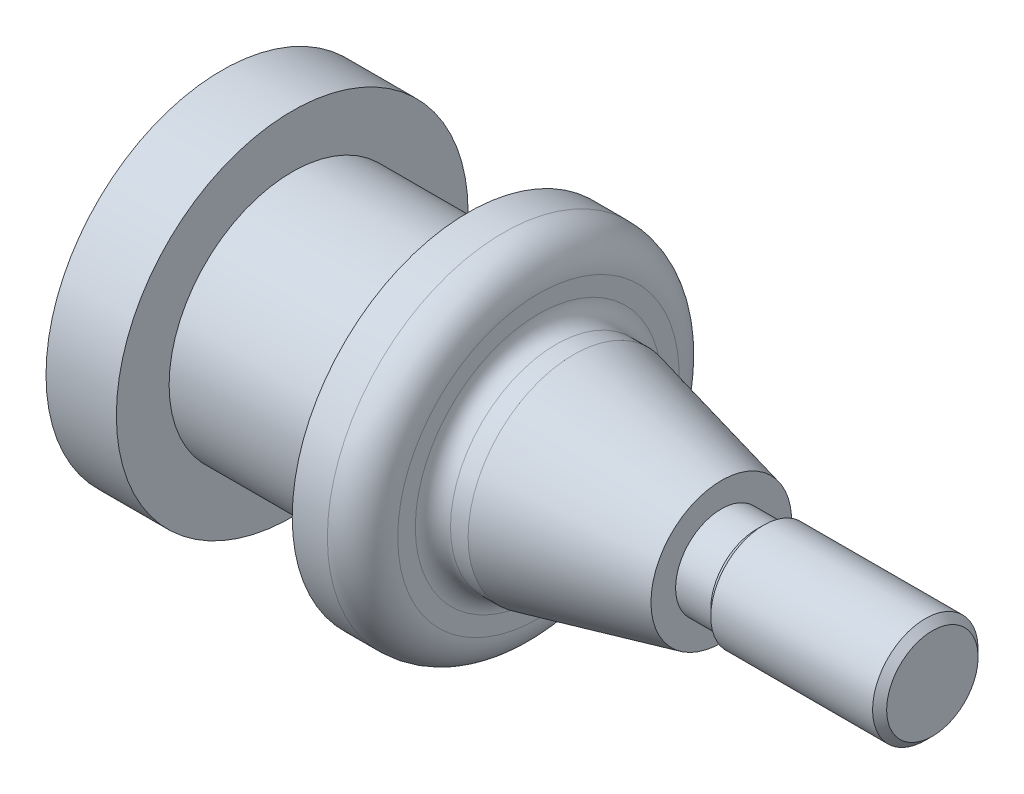
ISO-10303-21;
HEADER;
FILE_DESCRIPTION(('STEP AP214'),'2;1');
FILE_NAME('part.step','',(''),(''),'','','');
FILE_SCHEMA(('AUTOMOTIVE_DESIGN { 1 0 10303 214 1 1 1 1 }'));
ENDSEC;
DATA;
#1=APPLICATION_CONTEXT('core data for automotive mechanical design processes');
#2=APPLICATION_PROTOCOL_DEFINITION('international standard','automotive_design',2000,#1);
#3=PRODUCT_CONTEXT('',#1,'mechanical');
#4=PRODUCT('Part','Part','',(#3));
#5=PRODUCT_RELATED_PRODUCT_CATEGORY('part','',(#4));
#6=PRODUCT_DEFINITION_FORMATION('','',#4);
#7=PRODUCT_DEFINITION_CONTEXT('part definition',#1,'design');
#8=PRODUCT_DEFINITION('design','',#6,#7);
#9=PRODUCT_DEFINITION_SHAPE('','',#8);
#10=(LENGTH_UNIT() NAMED_UNIT(*) SI_UNIT(.MILLI.,.METRE.));
#11=(NAMED_UNIT(*) PLANE_ANGLE_UNIT() SI_UNIT($,.RADIAN.));
#12=(NAMED_UNIT(*) SI_UNIT($,.STERADIAN.) SOLID_ANGLE_UNIT());
#13=UNCERTAINTY_MEASURE_WITH_UNIT(LENGTH_MEASURE(1.E-05),#10,'distance_accuracy_value','');
#14=(GEOMETRIC_REPRESENTATION_CONTEXT(3) GLOBAL_UNCERTAINTY_ASSIGNED_CONTEXT((#13)) GLOBAL_UNIT_ASSIGNED_CONTEXT((#10,
#11,#12)) REPRESENTATION_CONTEXT('',''));
#15=CARTESIAN_POINT('',(0.,0.,0.));
#16=DIRECTION('',(0.,0.,1.));
#17=DIRECTION('',(1.,0.,0.));
#18=AXIS2_PLACEMENT_3D('',#15,#16,#17);
#19=CARTESIAN_POINT('',(0.,50.,0.));
#20=DIRECTION('',(1.,0.,0.));
#21=DIRECTION('',(0.,0.,-1.));
#22=AXIS2_PLACEMENT_3D('',#19,#20,#21);
#23=PLANE('',#22);
#24=CARTESIAN_POINT('',(0.,0.,0.));
#25=DIRECTION('',(-1.,0.,0.));
#26=DIRECTION('',(0.,0.,1.));
#27=AXIS2_PLACEMENT_3D('',#24,#25,#26);
#28=CIRCLE('',#27,50.);
#29=CARTESIAN_POINT('',(0.,0.,50.));
#30=VERTEX_POINT('',#29);
#31=EDGE_CURVE('E95',#30,#30,#28,.T.);
#32=ORIENTED_EDGE('',*,*,#31,.T.);
#33=EDGE_LOOP('',(#32));
#34=FACE_BOUND('',#33,.T.);
#35=ADVANCED_FACE('F41',(#34),#23,.F.);
#36=CARTESIAN_POINT('',(202.,0.,0.));
#37=DIRECTION('',(-1.,0.,0.));
#38=DIRECTION('',(0.,0.,1.));
#39=AXIS2_PLACEMENT_3D('',#36,#37,#38);
#40=PLANE('',#39);
#41=CARTESIAN_POINT('',(202.,0.,0.));
#42=DIRECTION('',(-1.,0.,0.));
#43=DIRECTION('',(0.,0.,1.));
#44=AXIS2_PLACEMENT_3D('',#41,#42,#43);
#45=CIRCLE('',#44,13.);
#46=CARTESIAN_POINT('',(202.,0.,13.));
#47=VERTEX_POINT('',#46);
#48=EDGE_CURVE('E10',#47,#47,#45,.F.);
#49=ORIENTED_EDGE('',*,*,#48,.T.);
#50=EDGE_LOOP('',(#49));
#51=FACE_BOUND('',#50,.T.);
#52=ADVANCED_FACE('F137',(#51),#40,.F.);
#53=CARTESIAN_POINT('',(0.,0.,0.));
#54=DIRECTION('',(-1.,0.,0.));
#55=DIRECTION('',(0.,0.,1.));
#56=AXIS2_PLACEMENT_3D('',#53,#54,#55);
#57=CYLINDRICAL_SURFACE('',#56,15.);
#58=CARTESIAN_POINT('',(154.,0.,0.));
#59=DIRECTION('',(1.,0.,0.));
#60=DIRECTION('',(0.,0.,-1.));
#61=AXIS2_PLACEMENT_3D('',#58,#59,#60);
#62=CIRCLE('',#61,15.);
#63=CARTESIAN_POINT('',(154.,0.,-15.));
#64=VERTEX_POINT('',#63);
#65=EDGE_CURVE('E49',#64,#64,#62,.T.);
#66=ORIENTED_EDGE('',*,*,#65,.T.);
#67=EDGE_LOOP('',(#66));
#68=FACE_BOUND('',#67,.T.);
#69=CARTESIAN_POINT('',(200.,0.,0.));
#70=DIRECTION('',(-1.,0.,0.));
#71=DIRECTION('',(0.,0.,1.));
#72=AXIS2_PLACEMENT_3D('',#69,#70,#71);
#73=CIRCLE('',#72,15.);
#74=CARTESIAN_POINT('',(200.,0.,15.));
#75=VERTEX_POINT('',#74);
#76=EDGE_CURVE('E53',#75,#75,#73,.T.);
#77=ORIENTED_EDGE('',*,*,#76,.T.);
#78=EDGE_LOOP('',(#77));
#79=FACE_BOUND('',#78,.T.);
#80=ADVANCED_FACE('F142',(#68,#79),#57,.T.);
#81=CARTESIAN_POINT('',(0.,0.,0.));
#82=DIRECTION('',(-1.,0.,0.));
#83=DIRECTION('',(0.,0.,1.));
#84=AXIS2_PLACEMENT_3D('',#81,#82,#83);
#85=CYLINDRICAL_SURFACE('',#84,13.);
#86=CARTESIAN_POINT('',(142.,0.,0.));
#87=DIRECTION('',(-1.,0.,0.));
#88=DIRECTION('',(0.,0.,1.));
#89=AXIS2_PLACEMENT_3D('',#86,#87,#88);
#90=CIRCLE('',#89,13.);
#91=CARTESIAN_POINT('',(142.,0.,13.));
#92=VERTEX_POINT('',#91);
#93=EDGE_CURVE('E74',#92,#92,#90,.T.);
#94=ORIENTED_EDGE('',*,*,#93,.F.);
#95=EDGE_LOOP('',(#94));
#96=FACE_BOUND('',#95,.T.);
#97=CARTESIAN_POINT('',(152.,0.,0.));
#98=DIRECTION('',(-1.,0.,0.));
#99=DIRECTION('',(0.,0.,1.));
#100=AXIS2_PLACEMENT_3D('',#97,#98,#99);
#101=CIRCLE('',#100,13.);
#102=CARTESIAN_POINT('',(152.,0.,13.));
#103=VERTEX_POINT('',#102);
#104=EDGE_CURVE('E71',#103,#103,#101,.T.);
#105=ORIENTED_EDGE('',*,*,#104,.T.);
#106=EDGE_LOOP('',(#105));
#107=FACE_BOUND('',#106,.T.);
#108=ADVANCED_FACE('F165',(#96,#107),#85,.T.);
#109=CARTESIAN_POINT('',(142.,13.,0.));
#110=DIRECTION('',(-1.,0.,0.));
#111=DIRECTION('',(0.,0.,1.));
#112=AXIS2_PLACEMENT_3D('',#109,#110,#111);
#113=PLANE('',#112);
#114=CARTESIAN_POINT('',(142.,0.,0.));
#115=DIRECTION('',(-1.,0.,0.));
#116=DIRECTION('',(0.,0.,1.));
#117=AXIS2_PLACEMENT_3D('',#114,#115,#116);
#118=CIRCLE('',#117,20.);
#119=CARTESIAN_POINT('',(142.,0.,20.));
#120=VERTEX_POINT('',#119);
#121=EDGE_CURVE('E77',#120,#120,#118,.T.);
#122=ORIENTED_EDGE('',*,*,#121,.F.);
#123=EDGE_LOOP('',(#122));
#124=FACE_BOUND('',#123,.T.);
#125=ORIENTED_EDGE('',*,*,#93,.T.);
#126=EDGE_LOOP('',(#125));
#127=FACE_BOUND('',#126,.T.);
#128=ADVANCED_FACE('F167',(#124,#127),#113,.F.);
#129=CARTESIAN_POINT('',(142.,0.,0.));
#130=DIRECTION('',(-1.,0.,0.));
#131=DIRECTION('',(0.,0.,1.));
#132=AXIS2_PLACEMENT_3D('',#129,#130,#131);
#133=CONICAL_SURFACE('',#132,20.,0.233743180868901);
#134=CARTESIAN_POINT('',(100.,0.,0.));
#135=DIRECTION('',(-1.,0.,0.));
#136=DIRECTION('',(0.,0.,1.));
#137=AXIS2_PLACEMENT_3D('',#134,#135,#136);
#138=CIRCLE('',#137,30.);
#139=CARTESIAN_POINT('',(100.,0.,30.));
#140=VERTEX_POINT('',#139);
#141=EDGE_CURVE('E80',#140,#140,#138,.T.);
#142=ORIENTED_EDGE('',*,*,#141,.F.);
#143=EDGE_LOOP('',(#142));
#144=FACE_BOUND('',#143,.T.);
#145=ORIENTED_EDGE('',*,*,#121,.T.);
#146=EDGE_LOOP('',(#145));
#147=FACE_BOUND('',#146,.T.);
#148=ADVANCED_FACE('F174',(#144,#147),#133,.T.);
#149=CARTESIAN_POINT('',(0.,0.,0.));
#150=DIRECTION('',(-1.,0.,0.));
#151=DIRECTION('',(0.,0.,1.));
#152=AXIS2_PLACEMENT_3D('',#149,#150,#151);
#153=CYLINDRICAL_SURFACE('',#152,30.);
#154=CARTESIAN_POINT('',(95.,0.,0.));
#155=DIRECTION('',(-1.,0.,0.));
#156=DIRECTION('',(0.,0.,1.));
#157=AXIS2_PLACEMENT_3D('',#154,#155,#156);
#158=CIRCLE('',#157,30.);
#159=CARTESIAN_POINT('',(95.,0.,30.));
#160=VERTEX_POINT('',#159);
#161=EDGE_CURVE('E65',#160,#160,#158,.F.);
#162=ORIENTED_EDGE('',*,*,#161,.T.);
#163=EDGE_LOOP('',(#162));
#164=FACE_BOUND('',#163,.T.);
#165=ORIENTED_EDGE('',*,*,#141,.T.);
#166=EDGE_LOOP('',(#165));
#167=FACE_BOUND('',#166,.T.);
#168=ADVANCED_FACE('F133',(#164,#167),#153,.T.);
#169=CARTESIAN_POINT('',(90.,30.,0.));
#170=DIRECTION('',(-1.,0.,0.));
#171=DIRECTION('',(0.,0.,1.));
#172=AXIS2_PLACEMENT_3D('',#169,#170,#171);
#173=PLANE('',#172);
#174=CARTESIAN_POINT('',(90.,0.,0.));
#175=DIRECTION('',(-1.,0.,0.));
#176=DIRECTION('',(0.,0.,1.));
#177=AXIS2_PLACEMENT_3D('',#174,#175,#176);
#178=CIRCLE('',#177,40.);
#179=CARTESIAN_POINT('',(90.,0.,40.));
#180=VERTEX_POINT('',#179);
#181=EDGE_CURVE('E57',#180,#180,#178,.F.);
#182=ORIENTED_EDGE('',*,*,#181,.T.);
#183=EDGE_LOOP('',(#182));
#184=FACE_BOUND('',#183,.T.);
#185=CARTESIAN_POINT('',(90.,0.,0.));
#186=DIRECTION('',(-1.,0.,0.));
#187=DIRECTION('',(0.,0.,1.));
#188=AXIS2_PLACEMENT_3D('',#185,#186,#187);
#189=CIRCLE('',#188,35.);
#190=CARTESIAN_POINT('',(90.,0.,35.));
#191=VERTEX_POINT('',#190);
#192=EDGE_CURVE('E68',#191,#191,#189,.T.);
#193=ORIENTED_EDGE('',*,*,#192,.T.);
#194=EDGE_LOOP('',(#193));
#195=FACE_BOUND('',#194,.T.);
#196=ADVANCED_FACE('F127',(#184,#195),#173,.F.);
#197=CARTESIAN_POINT('',(0.,0.,0.));
#198=DIRECTION('',(-1.,0.,0.));
#199=DIRECTION('',(0.,0.,1.));
#200=AXIS2_PLACEMENT_3D('',#197,#198,#199);
#201=CYLINDRICAL_SURFACE('',#200,50.);
#202=CARTESIAN_POINT('',(80.,0.,0.));
#203=DIRECTION('',(-1.,0.,0.));
#204=DIRECTION('',(0.,0.,1.));
#205=AXIS2_PLACEMENT_3D('',#202,#203,#204);
#206=CIRCLE('',#205,50.);
#207=CARTESIAN_POINT('',(80.,0.,50.));
#208=VERTEX_POINT('',#207);
#209=EDGE_CURVE('E62',#208,#208,#206,.T.);
#210=ORIENTED_EDGE('',*,*,#209,.T.);
#211=EDGE_LOOP('',(#210));
#212=FACE_BOUND('',#211,.T.);
#213=CARTESIAN_POINT('',(70.,0.,0.));
#214=DIRECTION('',(-1.,0.,0.));
#215=DIRECTION('',(0.,0.,1.));
#216=AXIS2_PLACEMENT_3D('',#213,#214,#215);
#217=CIRCLE('',#216,50.);
#218=CARTESIAN_POINT('',(70.,0.,50.));
#219=VERTEX_POINT('',#218);
#220=EDGE_CURVE('E83',#219,#219,#217,.T.);
#221=ORIENTED_EDGE('',*,*,#220,.F.);
#222=EDGE_LOOP('',(#221));
#223=FACE_BOUND('',#222,.T.);
#224=ADVANCED_FACE('F122',(#212,#223),#201,.T.);
#225=CARTESIAN_POINT('',(70.,50.,0.));
#226=DIRECTION('',(1.,0.,0.));
#227=DIRECTION('',(0.,0.,-1.));
#228=AXIS2_PLACEMENT_3D('',#225,#226,#227);
#229=PLANE('',#228);
#230=CARTESIAN_POINT('',(70.,0.,0.));
#231=DIRECTION('',(-1.,0.,0.));
#232=DIRECTION('',(0.,0.,1.));
#233=AXIS2_PLACEMENT_3D('',#230,#231,#232);
#234=CIRCLE('',#233,35.);
#235=CARTESIAN_POINT('',(70.,0.,35.));
#236=VERTEX_POINT('',#235);
#237=EDGE_CURVE('E86',#236,#236,#234,.T.);
#238=ORIENTED_EDGE('',*,*,#237,.F.);
#239=EDGE_LOOP('',(#238));
#240=FACE_BOUND('',#239,.T.);
#241=ORIENTED_EDGE('',*,*,#220,.T.);
#242=EDGE_LOOP('',(#241));
#243=FACE_BOUND('',#242,.T.);
#244=ADVANCED_FACE('F116',(#240,#243),#229,.F.);
#245=CARTESIAN_POINT('',(0.,0.,0.));
#246=DIRECTION('',(-1.,0.,0.));
#247=DIRECTION('',(0.,0.,1.));
#248=AXIS2_PLACEMENT_3D('',#245,#246,#247);
#249=CYLINDRICAL_SURFACE('',#248,35.);
#250=CARTESIAN_POINT('',(20.,0.,0.));
#251=DIRECTION('',(-1.,0.,0.));
#252=DIRECTION('',(0.,0.,1.));
#253=AXIS2_PLACEMENT_3D('',#250,#251,#252);
#254=CIRCLE('',#253,35.);
#255=CARTESIAN_POINT('',(20.,0.,35.));
#256=VERTEX_POINT('',#255);
#257=EDGE_CURVE('E89',#256,#256,#254,.T.);
#258=ORIENTED_EDGE('',*,*,#257,.F.);
#259=EDGE_LOOP('',(#258));
#260=FACE_BOUND('',#259,.T.);
#261=ORIENTED_EDGE('',*,*,#237,.T.);
#262=EDGE_LOOP('',(#261));
#263=FACE_BOUND('',#262,.T.);
#264=ADVANCED_FACE('F110',(#260,#263),#249,.T.);
#265=CARTESIAN_POINT('',(20.,35.,0.));
#266=DIRECTION('',(-1.,0.,0.));
#267=DIRECTION('',(0.,0.,1.));
#268=AXIS2_PLACEMENT_3D('',#265,#266,#267);
#269=PLANE('',#268);
#270=CARTESIAN_POINT('',(20.,0.,0.));
#271=DIRECTION('',(-1.,0.,0.));
#272=DIRECTION('',(0.,0.,1.));
#273=AXIS2_PLACEMENT_3D('',#270,#271,#272);
#274=CIRCLE('',#273,50.);
#275=CARTESIAN_POINT('',(20.,0.,50.));
#276=VERTEX_POINT('',#275);
#277=EDGE_CURVE('E92',#276,#276,#274,.T.);
#278=ORIENTED_EDGE('',*,*,#277,.F.);
#279=EDGE_LOOP('',(#278));
#280=FACE_BOUND('',#279,.T.);
#281=ORIENTED_EDGE('',*,*,#257,.T.);
#282=EDGE_LOOP('',(#281));
#283=FACE_BOUND('',#282,.T.);
#284=ADVANCED_FACE('F104',(#280,#283),#269,.F.);
#285=CARTESIAN_POINT('',(0.,0.,0.));
#286=DIRECTION('',(-1.,0.,0.));
#287=DIRECTION('',(0.,0.,1.));
#288=AXIS2_PLACEMENT_3D('',#285,#286,#287);
#289=CYLINDRICAL_SURFACE('',#288,50.);
#290=ORIENTED_EDGE('',*,*,#31,.F.);
#291=EDGE_LOOP('',(#290));
#292=FACE_BOUND('',#291,.T.);
#293=ORIENTED_EDGE('',*,*,#277,.T.);
#294=EDGE_LOOP('',(#293));
#295=FACE_BOUND('',#294,.T.);
#296=ADVANCED_FACE('F100',(#292,#295),#289,.T.);
#297=CARTESIAN_POINT('',(95.,0.,0.));
#298=DIRECTION('',(-1.,0.,0.));
#299=DIRECTION('',(0.,0.,1.));
#300=AXIS2_PLACEMENT_3D('',#297,#298,#299);
#301=TOROIDAL_SURFACE('',#300,35.,5.);
#302=ORIENTED_EDGE('',*,*,#161,.F.);
#303=EDGE_LOOP('',(#302));
#304=FACE_BOUND('',#303,.T.);
#305=ORIENTED_EDGE('',*,*,#192,.F.);
#306=EDGE_LOOP('',(#305));
#307=FACE_BOUND('',#306,.T.);
#308=ADVANCED_FACE('F103',(#304,#307),#301,.F.);
#309=CARTESIAN_POINT('',(80.,0.,0.));
#310=DIRECTION('',(-1.,0.,0.));
#311=DIRECTION('',(0.,0.,1.));
#312=AXIS2_PLACEMENT_3D('',#309,#310,#311);
#313=TOROIDAL_SURFACE('',#312,40.,10.);
#314=ORIENTED_EDGE('',*,*,#181,.F.);
#315=EDGE_LOOP('',(#314));
#316=FACE_BOUND('',#315,.T.);
#317=ORIENTED_EDGE('',*,*,#209,.F.);
#318=EDGE_LOOP('',(#317));
#319=FACE_BOUND('',#318,.T.);
#320=ADVANCED_FACE('F148',(#316,#319),#313,.T.);
#321=CARTESIAN_POINT('',(152.,0.,0.));
#322=DIRECTION('',(1.,0.,0.));
#323=DIRECTION('',(0.,0.,-1.));
#324=AXIS2_PLACEMENT_3D('',#321,#322,#323);
#325=CONICAL_SURFACE('',#324,13.,0.785398163397451);
#326=ORIENTED_EDGE('',*,*,#65,.F.);
#327=EDGE_LOOP('',(#326));
#328=FACE_BOUND('',#327,.T.);
#329=ORIENTED_EDGE('',*,*,#104,.F.);
#330=EDGE_LOOP('',(#329));
#331=FACE_BOUND('',#330,.T.);
#332=ADVANCED_FACE('F151',(#328,#331),#325,.T.);
#333=CARTESIAN_POINT('',(200.,0.,0.));
#334=DIRECTION('',(-1.,0.,0.));
#335=DIRECTION('',(0.,0.,1.));
#336=AXIS2_PLACEMENT_3D('',#333,#334,#335);
#337=CONICAL_SURFACE('',#336,15.,0.785398163397451);
#338=ORIENTED_EDGE('',*,*,#48,.F.);
#339=EDGE_LOOP('',(#338));
#340=FACE_BOUND('',#339,.T.);
#341=ORIENTED_EDGE('',*,*,#76,.F.);
#342=EDGE_LOOP('',(#341));
#343=FACE_BOUND('',#342,.T.);
#344=ADVANCED_FACE('F44',(#340,#343),#337,.T.);
#345=CLOSED_SHELL('',(#35,#52,#80,#108,#128,#148,#168,#196,#224,#244,#264,#284,#296,#308,#320,
#332,#344));
#346=MANIFOLD_SOLID_BREP('B2',#345);
#347=ADVANCED_BREP_SHAPE_REPRESENTATION('',(#18,#346),#14);
#348=SHAPE_DEFINITION_REPRESENTATION(#9,#347);
ENDSEC;
END-ISO-10303-21;
